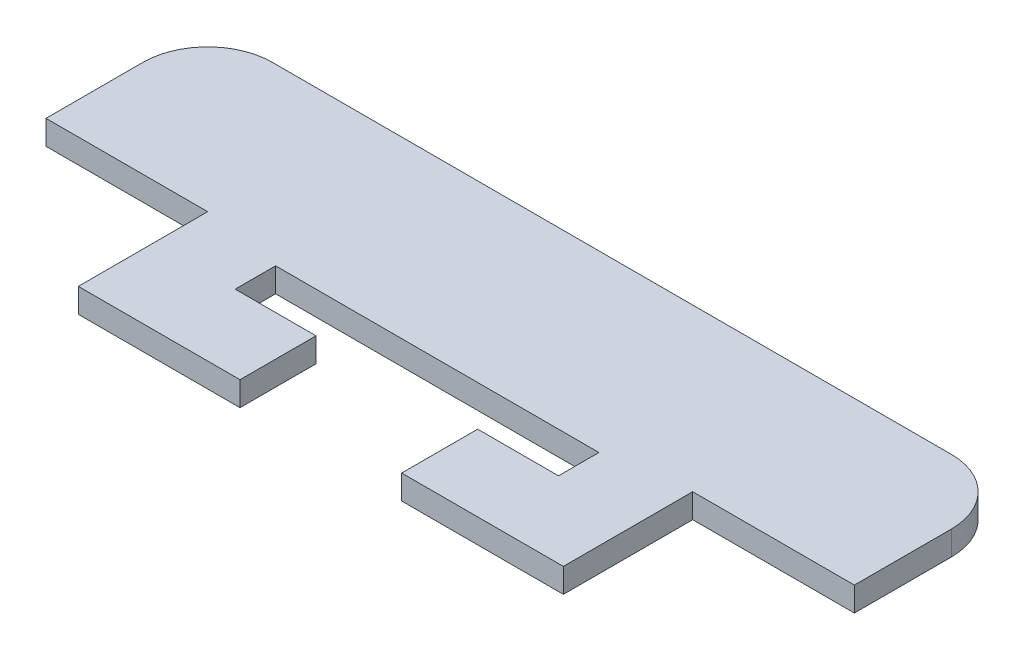
ISO-10303-21;
HEADER;
FILE_DESCRIPTION(('STEP AP214'),'2;1');
FILE_NAME('part.step','',(''),(''),'','','');
FILE_SCHEMA(('AUTOMOTIVE_DESIGN { 1 0 10303 214 1 1 1 1 }'));
ENDSEC;
DATA;
#1=APPLICATION_CONTEXT('core data for automotive mechanical design processes');
#2=APPLICATION_PROTOCOL_DEFINITION('international standard','automotive_design',2000,#1);
#3=PRODUCT_CONTEXT('',#1,'mechanical');
#4=PRODUCT('Part','Part','',(#3));
#5=PRODUCT_RELATED_PRODUCT_CATEGORY('part','',(#4));
#6=PRODUCT_DEFINITION_FORMATION('','',#4);
#7=PRODUCT_DEFINITION_CONTEXT('part definition',#1,'design');
#8=PRODUCT_DEFINITION('design','',#6,#7);
#9=PRODUCT_DEFINITION_SHAPE('','',#8);
#10=(LENGTH_UNIT() NAMED_UNIT(*) SI_UNIT(.MILLI.,.METRE.));
#11=(NAMED_UNIT(*) PLANE_ANGLE_UNIT() SI_UNIT($,.RADIAN.));
#12=(NAMED_UNIT(*) SI_UNIT($,.STERADIAN.) SOLID_ANGLE_UNIT());
#13=UNCERTAINTY_MEASURE_WITH_UNIT(LENGTH_MEASURE(1.E-05),#10,'distance_accuracy_value','');
#14=(GEOMETRIC_REPRESENTATION_CONTEXT(3) GLOBAL_UNCERTAINTY_ASSIGNED_CONTEXT((#13)) GLOBAL_UNIT_ASSIGNED_CONTEXT((#10,
#11,#12)) REPRESENTATION_CONTEXT('',''));
#15=CARTESIAN_POINT('',(0.,0.,0.));
#16=DIRECTION('',(0.,0.,1.));
#17=DIRECTION('',(1.,0.,0.));
#18=AXIS2_PLACEMENT_3D('',#15,#16,#17);
#19=CARTESIAN_POINT('',(-31.75,1.905,0.));
#20=DIRECTION('',(1.,0.,0.));
#21=DIRECTION('',(0.,0.,-1.));
#22=AXIS2_PLACEMENT_3D('',#19,#20,#21);
#23=PLANE('',#22);
#24=DIRECTION('',(0.,0.,1.));
#25=VECTOR('',#24,1.);
#26=CARTESIAN_POINT('',(-31.75,1.905,0.));
#27=LINE('',#26,#25);
#28=CARTESIAN_POINT('',(-31.75,1.905,-7.62));
#29=VERTEX_POINT('',#28);
#30=CARTESIAN_POINT('',(-31.75,1.905,0.));
#31=VERTEX_POINT('',#30);
#32=EDGE_CURVE('E233',#29,#31,#27,.T.);
#33=ORIENTED_EDGE('',*,*,#32,.F.);
#34=DIRECTION('',(0.,-1.,0.));
#35=VECTOR('',#34,1.);
#36=CARTESIAN_POINT('',(-31.75,1.905,-7.62));
#37=LINE('',#36,#35);
#38=CARTESIAN_POINT('',(-31.75,0.,-7.62));
#39=VERTEX_POINT('',#38);
#40=EDGE_CURVE('E11',#29,#39,#37,.T.);
#41=ORIENTED_EDGE('',*,*,#40,.T.);
#42=DIRECTION('',(0.,0.,1.));
#43=VECTOR('',#42,1.);
#44=CARTESIAN_POINT('',(-31.75,0.,0.));
#45=LINE('',#44,#43);
#46=CARTESIAN_POINT('',(-31.75,0.,0.));
#47=VERTEX_POINT('',#46);
#48=EDGE_CURVE('E232',#39,#47,#45,.T.);
#49=ORIENTED_EDGE('',*,*,#48,.T.);
#50=DIRECTION('',(0.,-1.,0.));
#51=VECTOR('',#50,1.);
#52=CARTESIAN_POINT('',(-31.75,1.905,0.));
#53=LINE('',#52,#51);
#54=EDGE_CURVE('E331',#31,#47,#53,.T.);
#55=ORIENTED_EDGE('',*,*,#54,.F.);
#56=EDGE_LOOP('',(#33,#41,#49,#55));
#57=FACE_BOUND('',#56,.T.);
#58=ADVANCED_FACE('F41',(#57),#23,.F.);
#59=CARTESIAN_POINT('',(-31.75,1.905,0.));
#60=DIRECTION('',(0.,0.,-1.));
#61=DIRECTION('',(-1.,0.,0.));
#62=AXIS2_PLACEMENT_3D('',#59,#60,#61);
#63=PLANE('',#62);
#64=DIRECTION('',(1.,0.,0.));
#65=VECTOR('',#64,1.);
#66=CARTESIAN_POINT('',(-31.75,0.,0.));
#67=LINE('',#66,#65);
#68=CARTESIAN_POINT('',(-19.05,0.,0.));
#69=VERTEX_POINT('',#68);
#70=EDGE_CURVE('E275',#47,#69,#67,.T.);
#71=ORIENTED_EDGE('',*,*,#70,.T.);
#72=DIRECTION('',(0.,-1.,0.));
#73=VECTOR('',#72,1.);
#74=CARTESIAN_POINT('',(-19.05,1.905,0.));
#75=LINE('',#74,#73);
#76=CARTESIAN_POINT('',(-19.05,1.905,0.));
#77=VERTEX_POINT('',#76);
#78=EDGE_CURVE('E327',#77,#69,#75,.T.);
#79=ORIENTED_EDGE('',*,*,#78,.F.);
#80=DIRECTION('',(1.,0.,0.));
#81=VECTOR('',#80,1.);
#82=CARTESIAN_POINT('',(-31.75,1.905,0.));
#83=LINE('',#82,#81);
#84=EDGE_CURVE('E236',#31,#77,#83,.T.);
#85=ORIENTED_EDGE('',*,*,#84,.F.);
#86=ORIENTED_EDGE('',*,*,#54,.T.);
#87=EDGE_LOOP('',(#71,#79,#85,#86));
#88=FACE_BOUND('',#87,.T.);
#89=ADVANCED_FACE('F415',(#88),#63,.F.);
#90=CARTESIAN_POINT('',(-19.05,1.905,0.));
#91=DIRECTION('',(1.,0.,0.));
#92=DIRECTION('',(0.,0.,-1.));
#93=AXIS2_PLACEMENT_3D('',#90,#91,#92);
#94=PLANE('',#93);
#95=DIRECTION('',(0.,0.,1.));
#96=VECTOR('',#95,1.);
#97=CARTESIAN_POINT('',(-19.05,0.,0.));
#98=LINE('',#97,#96);
#99=CARTESIAN_POINT('',(-19.05,0.,10.16));
#100=VERTEX_POINT('',#99);
#101=EDGE_CURVE('E278',#69,#100,#98,.T.);
#102=ORIENTED_EDGE('',*,*,#101,.T.);
#103=DIRECTION('',(0.,-1.,0.));
#104=VECTOR('',#103,1.);
#105=CARTESIAN_POINT('',(-19.05,1.905,10.16));
#106=LINE('',#105,#104);
#107=CARTESIAN_POINT('',(-19.05,1.905,10.16));
#108=VERTEX_POINT('',#107);
#109=EDGE_CURVE('E323',#108,#100,#106,.T.);
#110=ORIENTED_EDGE('',*,*,#109,.F.);
#111=DIRECTION('',(0.,0.,1.));
#112=VECTOR('',#111,1.);
#113=CARTESIAN_POINT('',(-19.05,1.905,0.));
#114=LINE('',#113,#112);
#115=EDGE_CURVE('E240',#77,#108,#114,.T.);
#116=ORIENTED_EDGE('',*,*,#115,.F.);
#117=ORIENTED_EDGE('',*,*,#78,.T.);
#118=EDGE_LOOP('',(#102,#110,#116,#117));
#119=FACE_BOUND('',#118,.T.);
#120=ADVANCED_FACE('F411',(#119),#94,.F.);
#121=CARTESIAN_POINT('',(-19.05,1.905,10.16));
#122=DIRECTION('',(0.,0.,-1.));
#123=DIRECTION('',(-1.,0.,0.));
#124=AXIS2_PLACEMENT_3D('',#121,#122,#123);
#125=PLANE('',#124);
#126=DIRECTION('',(1.,0.,0.));
#127=VECTOR('',#126,1.);
#128=CARTESIAN_POINT('',(-19.05,0.,10.16));
#129=LINE('',#128,#127);
#130=CARTESIAN_POINT('',(-6.35,0.,10.16));
#131=VERTEX_POINT('',#130);
#132=EDGE_CURVE('E281',#100,#131,#129,.T.);
#133=ORIENTED_EDGE('',*,*,#132,.T.);
#134=DIRECTION('',(0.,1.,0.));
#135=VECTOR('',#134,1.);
#136=CARTESIAN_POINT('',(-6.35,-14.0327816558229,10.16));
#137=LINE('',#136,#135);
#138=CARTESIAN_POINT('',(-6.35,1.905,10.16));
#139=VERTEX_POINT('',#138);
#140=EDGE_CURVE('E213',#131,#139,#137,.T.);
#141=ORIENTED_EDGE('',*,*,#140,.T.);
#142=DIRECTION('',(1.,0.,0.));
#143=VECTOR('',#142,1.);
#144=CARTESIAN_POINT('',(-19.05,1.905,10.16));
#145=LINE('',#144,#143);
#146=EDGE_CURVE('E243',#108,#139,#145,.T.);
#147=ORIENTED_EDGE('',*,*,#146,.F.);
#148=ORIENTED_EDGE('',*,*,#109,.T.);
#149=EDGE_LOOP('',(#133,#141,#147,#148));
#150=FACE_BOUND('',#149,.T.);
#151=ADVANCED_FACE('F407',(#150),#125,.F.);
#152=CARTESIAN_POINT('',(-12.7,1.905,10.16));
#153=DIRECTION('',(-1.,0.,0.));
#154=DIRECTION('',(0.,0.,1.));
#155=AXIS2_PLACEMENT_3D('',#152,#153,#154);
#156=PLANE('',#155);
#157=DIRECTION('',(0.,0.,-1.));
#158=VECTOR('',#157,1.);
#159=CARTESIAN_POINT('',(-12.7,1.905,10.16));
#160=LINE('',#159,#158);
#161=CARTESIAN_POINT('',(-12.7,1.905,4.191));
#162=VERTEX_POINT('',#161);
#163=CARTESIAN_POINT('',(-12.7,1.905,1.016));
#164=VERTEX_POINT('',#163);
#165=EDGE_CURVE('E246',#162,#164,#160,.T.);
#166=ORIENTED_EDGE('',*,*,#165,.F.);
#167=DIRECTION('',(0.,-1.,0.));
#168=VECTOR('',#167,1.);
#169=CARTESIAN_POINT('',(-12.7,1.905,4.191));
#170=LINE('',#169,#168);
#171=CARTESIAN_POINT('',(-12.7,0.,4.191));
#172=VERTEX_POINT('',#171);
#173=EDGE_CURVE('E219',#162,#172,#170,.T.);
#174=ORIENTED_EDGE('',*,*,#173,.T.);
#175=DIRECTION('',(0.,0.,-1.));
#176=VECTOR('',#175,1.);
#177=CARTESIAN_POINT('',(-12.7,0.,10.16));
#178=LINE('',#177,#176);
#179=CARTESIAN_POINT('',(-12.7,0.,1.016));
#180=VERTEX_POINT('',#179);
#181=EDGE_CURVE('E284',#172,#180,#178,.T.);
#182=ORIENTED_EDGE('',*,*,#181,.T.);
#183=DIRECTION('',(0.,-1.,0.));
#184=VECTOR('',#183,1.);
#185=CARTESIAN_POINT('',(-12.7,1.905,1.016));
#186=LINE('',#185,#184);
#187=EDGE_CURVE('E319',#164,#180,#186,.T.);
#188=ORIENTED_EDGE('',*,*,#187,.F.);
#189=EDGE_LOOP('',(#166,#174,#182,#188));
#190=FACE_BOUND('',#189,.T.);
#191=ADVANCED_FACE('F395',(#190),#156,.F.);
#192=CARTESIAN_POINT('',(-12.7,1.905,1.016));
#193=DIRECTION('',(0.,0.,-1.));
#194=DIRECTION('',(-1.,0.,0.));
#195=AXIS2_PLACEMENT_3D('',#192,#193,#194);
#196=PLANE('',#195);
#197=DIRECTION('',(1.,0.,0.));
#198=VECTOR('',#197,1.);
#199=CARTESIAN_POINT('',(-12.7,0.,1.016));
#200=LINE('',#199,#198);
#201=CARTESIAN_POINT('',(12.7,0.,1.016));
#202=VERTEX_POINT('',#201);
#203=EDGE_CURVE('E287',#180,#202,#200,.T.);
#204=ORIENTED_EDGE('',*,*,#203,.T.);
#205=DIRECTION('',(0.,-1.,0.));
#206=VECTOR('',#205,1.);
#207=CARTESIAN_POINT('',(12.7,1.905,1.016));
#208=LINE('',#207,#206);
#209=CARTESIAN_POINT('',(12.7,1.905,1.016));
#210=VERTEX_POINT('',#209);
#211=EDGE_CURVE('E315',#210,#202,#208,.T.);
#212=ORIENTED_EDGE('',*,*,#211,.F.);
#213=DIRECTION('',(1.,0.,0.));
#214=VECTOR('',#213,1.);
#215=CARTESIAN_POINT('',(-12.7,1.905,1.016));
#216=LINE('',#215,#214);
#217=EDGE_CURVE('E249',#164,#210,#216,.T.);
#218=ORIENTED_EDGE('',*,*,#217,.F.);
#219=ORIENTED_EDGE('',*,*,#187,.T.);
#220=EDGE_LOOP('',(#204,#212,#218,#219));
#221=FACE_BOUND('',#220,.T.);
#222=ADVANCED_FACE('F389',(#221),#196,.F.);
#223=CARTESIAN_POINT('',(12.7,1.905,10.16));
#224=DIRECTION('',(1.,0.,0.));
#225=DIRECTION('',(0.,0.,-1.));
#226=AXIS2_PLACEMENT_3D('',#223,#224,#225);
#227=PLANE('',#226);
#228=DIRECTION('',(0.,0.,1.));
#229=VECTOR('',#228,1.);
#230=CARTESIAN_POINT('',(12.7,0.,10.16));
#231=LINE('',#230,#229);
#232=CARTESIAN_POINT('',(12.7,0.,4.191));
#233=VERTEX_POINT('',#232);
#234=EDGE_CURVE('E180',#202,#233,#231,.T.);
#235=ORIENTED_EDGE('',*,*,#234,.T.);
#236=DIRECTION('',(0.,1.,0.));
#237=VECTOR('',#236,1.);
#238=CARTESIAN_POINT('',(12.7,1.905,4.191));
#239=LINE('',#238,#237);
#240=CARTESIAN_POINT('',(12.7,1.905,4.191));
#241=VERTEX_POINT('',#240);
#242=EDGE_CURVE('E205',#233,#241,#239,.T.);
#243=ORIENTED_EDGE('',*,*,#242,.T.);
#244=DIRECTION('',(0.,0.,1.));
#245=VECTOR('',#244,1.);
#246=CARTESIAN_POINT('',(12.7,1.905,10.16));
#247=LINE('',#246,#245);
#248=EDGE_CURVE('E252',#210,#241,#247,.T.);
#249=ORIENTED_EDGE('',*,*,#248,.F.);
#250=ORIENTED_EDGE('',*,*,#211,.T.);
#251=EDGE_LOOP('',(#235,#243,#249,#250));
#252=FACE_BOUND('',#251,.T.);
#253=ADVANCED_FACE('F385',(#252),#227,.F.);
#254=CARTESIAN_POINT('',(12.7,1.905,10.16));
#255=DIRECTION('',(0.,0.,-1.));
#256=DIRECTION('',(-1.,0.,0.));
#257=AXIS2_PLACEMENT_3D('',#254,#255,#256);
#258=PLANE('',#257);
#259=DIRECTION('',(1.,0.,0.));
#260=VECTOR('',#259,1.);
#261=CARTESIAN_POINT('',(12.7,0.,10.16));
#262=LINE('',#261,#260);
#263=CARTESIAN_POINT('',(6.35000000000001,0.,10.16));
#264=VERTEX_POINT('',#263);
#265=CARTESIAN_POINT('',(19.05,0.,10.16));
#266=VERTEX_POINT('',#265);
#267=EDGE_CURVE('E167',#264,#266,#262,.T.);
#268=ORIENTED_EDGE('',*,*,#267,.T.);
#269=DIRECTION('',(0.,-1.,0.));
#270=VECTOR('',#269,1.);
#271=CARTESIAN_POINT('',(19.05,1.905,10.16));
#272=LINE('',#271,#270);
#273=CARTESIAN_POINT('',(19.05,1.905,10.16));
#274=VERTEX_POINT('',#273);
#275=EDGE_CURVE('E312',#274,#266,#272,.T.);
#276=ORIENTED_EDGE('',*,*,#275,.F.);
#277=DIRECTION('',(1.,0.,0.));
#278=VECTOR('',#277,1.);
#279=CARTESIAN_POINT('',(12.7,1.905,10.16));
#280=LINE('',#279,#278);
#281=CARTESIAN_POINT('',(6.35000000000001,1.905,10.16));
#282=VERTEX_POINT('',#281);
#283=EDGE_CURVE('E185',#282,#274,#280,.T.);
#284=ORIENTED_EDGE('',*,*,#283,.F.);
#285=DIRECTION('',(0.,1.,0.));
#286=VECTOR('',#285,1.);
#287=CARTESIAN_POINT('',(6.35000000000001,-14.0327816558229,10.16));
#288=LINE('',#287,#286);
#289=EDGE_CURVE('E183',#264,#282,#288,.T.);
#290=ORIENTED_EDGE('',*,*,#289,.F.);
#291=EDGE_LOOP('',(#268,#276,#284,#290));
#292=FACE_BOUND('',#291,.T.);
#293=ADVANCED_FACE('F184',(#292),#258,.F.);
#294=CARTESIAN_POINT('',(19.05,1.905,0.));
#295=DIRECTION('',(-1.,0.,0.));
#296=DIRECTION('',(0.,0.,1.));
#297=AXIS2_PLACEMENT_3D('',#294,#295,#296);
#298=PLANE('',#297);
#299=DIRECTION('',(0.,-1.,0.));
#300=VECTOR('',#299,1.);
#301=CARTESIAN_POINT('',(19.05,1.905,0.));
#302=LINE('',#301,#300);
#303=CARTESIAN_POINT('',(19.05,1.905,0.));
#304=VERTEX_POINT('',#303);
#305=CARTESIAN_POINT('',(19.05,0.,0.));
#306=VERTEX_POINT('',#305);
#307=EDGE_CURVE('E308',#304,#306,#302,.T.);
#308=ORIENTED_EDGE('',*,*,#307,.F.);
#309=DIRECTION('',(0.,0.,-1.));
#310=VECTOR('',#309,1.);
#311=CARTESIAN_POINT('',(19.05,1.905,0.));
#312=LINE('',#311,#310);
#313=EDGE_CURVE('E258',#274,#304,#312,.T.);
#314=ORIENTED_EDGE('',*,*,#313,.F.);
#315=ORIENTED_EDGE('',*,*,#275,.T.);
#316=DIRECTION('',(0.,0.,-1.));
#317=VECTOR('',#316,1.);
#318=CARTESIAN_POINT('',(19.05,0.,0.));
#319=LINE('',#318,#317);
#320=EDGE_CURVE('E175',#266,#306,#319,.T.);
#321=ORIENTED_EDGE('',*,*,#320,.T.);
#322=EDGE_LOOP('',(#308,#314,#315,#321));
#323=FACE_BOUND('',#322,.T.);
#324=ADVANCED_FACE('F378',(#323),#298,.F.);
#325=CARTESIAN_POINT('',(19.05,1.905,0.));
#326=DIRECTION('',(0.,0.,-1.));
#327=DIRECTION('',(-1.,0.,0.));
#328=AXIS2_PLACEMENT_3D('',#325,#326,#327);
#329=PLANE('',#328);
#330=DIRECTION('',(1.,0.,0.));
#331=VECTOR('',#330,1.);
#332=CARTESIAN_POINT('',(19.05,0.,0.));
#333=LINE('',#332,#331);
#334=CARTESIAN_POINT('',(31.75,0.,0.));
#335=VERTEX_POINT('',#334);
#336=EDGE_CURVE('E295',#306,#335,#333,.T.);
#337=ORIENTED_EDGE('',*,*,#336,.T.);
#338=DIRECTION('',(0.,-1.,0.));
#339=VECTOR('',#338,1.);
#340=CARTESIAN_POINT('',(31.75,1.905,0.));
#341=LINE('',#340,#339);
#342=CARTESIAN_POINT('',(31.75,1.905,0.));
#343=VERTEX_POINT('',#342);
#344=EDGE_CURVE('E272',#343,#335,#341,.T.);
#345=ORIENTED_EDGE('',*,*,#344,.F.);
#346=DIRECTION('',(1.,0.,0.));
#347=VECTOR('',#346,1.);
#348=CARTESIAN_POINT('',(19.05,1.905,0.));
#349=LINE('',#348,#347);
#350=EDGE_CURVE('E261',#304,#343,#349,.T.);
#351=ORIENTED_EDGE('',*,*,#350,.F.);
#352=ORIENTED_EDGE('',*,*,#307,.T.);
#353=EDGE_LOOP('',(#337,#345,#351,#352));
#354=FACE_BOUND('',#353,.T.);
#355=ADVANCED_FACE('F374',(#354),#329,.F.);
#356=CARTESIAN_POINT('',(31.75,1.905,0.));
#357=DIRECTION('',(-1.,0.,0.));
#358=DIRECTION('',(0.,0.,1.));
#359=AXIS2_PLACEMENT_3D('',#356,#357,#358);
#360=PLANE('',#359);
#361=DIRECTION('',(0.,0.,-1.));
#362=VECTOR('',#361,1.);
#363=CARTESIAN_POINT('',(31.75,0.,0.));
#364=LINE('',#363,#362);
#365=CARTESIAN_POINT('',(31.75,0.,-7.62));
#366=VERTEX_POINT('',#365);
#367=EDGE_CURVE('E298',#335,#366,#364,.T.);
#368=ORIENTED_EDGE('',*,*,#367,.T.);
#369=DIRECTION('',(0.,-1.,0.));
#370=VECTOR('',#369,1.);
#371=CARTESIAN_POINT('',(31.75,1.905,-7.62));
#372=LINE('',#371,#370);
#373=CARTESIAN_POINT('',(31.75,1.905,-7.62));
#374=VERTEX_POINT('',#373);
#375=EDGE_CURVE('E348',#366,#374,#372,.F.);
#376=ORIENTED_EDGE('',*,*,#375,.T.);
#377=DIRECTION('',(0.,0.,-1.));
#378=VECTOR('',#377,1.);
#379=CARTESIAN_POINT('',(31.75,1.905,0.));
#380=LINE('',#379,#378);
#381=EDGE_CURVE('E264',#343,#374,#380,.T.);
#382=ORIENTED_EDGE('',*,*,#381,.F.);
#383=ORIENTED_EDGE('',*,*,#344,.T.);
#384=EDGE_LOOP('',(#368,#376,#382,#383));
#385=FACE_BOUND('',#384,.T.);
#386=ADVANCED_FACE('F370',(#385),#360,.F.);
#387=CARTESIAN_POINT('',(-31.75,1.905,-12.7));
#388=DIRECTION('',(0.,0.,1.));
#389=DIRECTION('',(1.,0.,0.));
#390=AXIS2_PLACEMENT_3D('',#387,#388,#389);
#391=PLANE('',#390);
#392=DIRECTION('',(-1.,0.,0.));
#393=VECTOR('',#392,1.);
#394=CARTESIAN_POINT('',(-31.75,1.905,-12.7));
#395=LINE('',#394,#393);
#396=CARTESIAN_POINT('',(26.67,1.905,-12.7));
#397=VERTEX_POINT('',#396);
#398=CARTESIAN_POINT('',(-26.67,1.905,-12.7));
#399=VERTEX_POINT('',#398);
#400=EDGE_CURVE('E268',#397,#399,#395,.T.);
#401=ORIENTED_EDGE('',*,*,#400,.F.);
#402=DIRECTION('',(0.,-1.,0.));
#403=VECTOR('',#402,1.);
#404=CARTESIAN_POINT('',(26.67,1.905,-12.7));
#405=LINE('',#404,#403);
#406=CARTESIAN_POINT('',(26.67,0.,-12.7));
#407=VERTEX_POINT('',#406);
#408=EDGE_CURVE('E338',#397,#407,#405,.T.);
#409=ORIENTED_EDGE('',*,*,#408,.T.);
#410=DIRECTION('',(-1.,0.,0.));
#411=VECTOR('',#410,1.);
#412=CARTESIAN_POINT('',(-31.75,0.,-12.7));
#413=LINE('',#412,#411);
#414=CARTESIAN_POINT('',(-26.67,0.,-12.7));
#415=VERTEX_POINT('',#414);
#416=EDGE_CURVE('E237',#407,#415,#413,.T.);
#417=ORIENTED_EDGE('',*,*,#416,.T.);
#418=DIRECTION('',(0.,-1.,0.));
#419=VECTOR('',#418,1.);
#420=CARTESIAN_POINT('',(-26.67,1.905,-12.7));
#421=LINE('',#420,#419);
#422=EDGE_CURVE('E335',#415,#399,#421,.F.);
#423=ORIENTED_EDGE('',*,*,#422,.T.);
#424=EDGE_LOOP('',(#401,#409,#417,#423));
#425=FACE_BOUND('',#424,.T.);
#426=ADVANCED_FACE('F364',(#425),#391,.F.);
#427=CARTESIAN_POINT('',(0.,1.905,0.));
#428=DIRECTION('',(0.,-1.,0.));
#429=DIRECTION('',(0.,0.,-1.));
#430=AXIS2_PLACEMENT_3D('',#427,#428,#429);
#431=PLANE('',#430);
#432=ORIENTED_EDGE('',*,*,#248,.T.);
#433=DIRECTION('',(-1.,0.,0.));
#434=VECTOR('',#433,1.);
#435=CARTESIAN_POINT('',(19.05,1.905,4.191));
#436=LINE('',#435,#434);
#437=CARTESIAN_POINT('',(6.35000000000001,1.905,4.191));
#438=VERTEX_POINT('',#437);
#439=EDGE_CURVE('E57',#241,#438,#436,.T.);
#440=ORIENTED_EDGE('',*,*,#439,.T.);
#441=DIRECTION('',(0.,0.,1.));
#442=VECTOR('',#441,1.);
#443=CARTESIAN_POINT('',(6.35000000000001,1.905,4.191));
#444=LINE('',#443,#442);
#445=EDGE_CURVE('E195',#438,#282,#444,.T.);
#446=ORIENTED_EDGE('',*,*,#445,.T.);
#447=ORIENTED_EDGE('',*,*,#283,.T.);
#448=ORIENTED_EDGE('',*,*,#313,.T.);
#449=ORIENTED_EDGE('',*,*,#350,.T.);
#450=ORIENTED_EDGE('',*,*,#381,.T.);
#451=CARTESIAN_POINT('',(26.67,1.905,-7.62));
#452=DIRECTION('',(0.,-1.,0.));
#453=DIRECTION('',(0.,0.,-1.));
#454=AXIS2_PLACEMENT_3D('',#451,#452,#453);
#455=CIRCLE('',#454,5.08);
#456=EDGE_CURVE('E50',#374,#397,#455,.F.);
#457=ORIENTED_EDGE('',*,*,#456,.T.);
#458=ORIENTED_EDGE('',*,*,#400,.T.);
#459=CARTESIAN_POINT('',(-26.67,1.905,-7.62));
#460=DIRECTION('',(0.,-1.,0.));
#461=DIRECTION('',(0.,0.,-1.));
#462=AXIS2_PLACEMENT_3D('',#459,#460,#461);
#463=CIRCLE('',#462,5.08);
#464=EDGE_CURVE('E351',#399,#29,#463,.F.);
#465=ORIENTED_EDGE('',*,*,#464,.T.);
#466=ORIENTED_EDGE('',*,*,#32,.T.);
#467=ORIENTED_EDGE('',*,*,#84,.T.);
#468=ORIENTED_EDGE('',*,*,#115,.T.);
#469=ORIENTED_EDGE('',*,*,#146,.T.);
#470=DIRECTION('',(0.,0.,-1.));
#471=VECTOR('',#470,1.);
#472=CARTESIAN_POINT('',(-6.35,1.905,4.191));
#473=LINE('',#472,#471);
#474=CARTESIAN_POINT('',(-6.35,1.905,4.191));
#475=VERTEX_POINT('',#474);
#476=EDGE_CURVE('E208',#139,#475,#473,.T.);
#477=ORIENTED_EDGE('',*,*,#476,.T.);
#478=DIRECTION('',(-1.,0.,0.));
#479=VECTOR('',#478,1.);
#480=CARTESIAN_POINT('',(-19.05,1.905,4.191));
#481=LINE('',#480,#479);
#482=EDGE_CURVE('E209',#475,#162,#481,.T.);
#483=ORIENTED_EDGE('',*,*,#482,.T.);
#484=ORIENTED_EDGE('',*,*,#165,.T.);
#485=ORIENTED_EDGE('',*,*,#217,.T.);
#486=EDGE_LOOP('',(#432,#440,#446,#447,#448,#449,#450,#457,#458,#465,#466,#467,#468,#469,#477,
#483,#484,#485));
#487=FACE_BOUND('',#486,.T.);
#488=ADVANCED_FACE('F357',(#487),#431,.F.);
#489=CARTESIAN_POINT('',(0.,0.,0.));
#490=DIRECTION('',(0.,-1.,0.));
#491=DIRECTION('',(0.,0.,-1.));
#492=AXIS2_PLACEMENT_3D('',#489,#490,#491);
#493=PLANE('',#492);
#494=ORIENTED_EDGE('',*,*,#336,.F.);
#495=ORIENTED_EDGE('',*,*,#320,.F.);
#496=ORIENTED_EDGE('',*,*,#267,.F.);
#497=DIRECTION('',(0.,0.,1.));
#498=VECTOR('',#497,1.);
#499=CARTESIAN_POINT('',(6.35000000000001,0.,4.191));
#500=LINE('',#499,#498);
#501=CARTESIAN_POINT('',(6.35000000000001,0.,4.191));
#502=VERTEX_POINT('',#501);
#503=EDGE_CURVE('E173',#502,#264,#500,.T.);
#504=ORIENTED_EDGE('',*,*,#503,.F.);
#505=DIRECTION('',(-1.,0.,0.));
#506=VECTOR('',#505,1.);
#507=CARTESIAN_POINT('',(19.05,0.,4.191));
#508=LINE('',#507,#506);
#509=EDGE_CURVE('E190',#233,#502,#508,.T.);
#510=ORIENTED_EDGE('',*,*,#509,.F.);
#511=ORIENTED_EDGE('',*,*,#234,.F.);
#512=ORIENTED_EDGE('',*,*,#203,.F.);
#513=ORIENTED_EDGE('',*,*,#181,.F.);
#514=DIRECTION('',(-1.,0.,0.));
#515=VECTOR('',#514,1.);
#516=CARTESIAN_POINT('',(-19.05,0.,4.191));
#517=LINE('',#516,#515);
#518=CARTESIAN_POINT('',(-6.35,0.,4.191));
#519=VERTEX_POINT('',#518);
#520=EDGE_CURVE('E65',#519,#172,#517,.T.);
#521=ORIENTED_EDGE('',*,*,#520,.F.);
#522=DIRECTION('',(0.,0.,-1.));
#523=VECTOR('',#522,1.);
#524=CARTESIAN_POINT('',(-6.35,0.,4.191));
#525=LINE('',#524,#523);
#526=EDGE_CURVE('E221',#131,#519,#525,.T.);
#527=ORIENTED_EDGE('',*,*,#526,.F.);
#528=ORIENTED_EDGE('',*,*,#132,.F.);
#529=ORIENTED_EDGE('',*,*,#101,.F.);
#530=ORIENTED_EDGE('',*,*,#70,.F.);
#531=ORIENTED_EDGE('',*,*,#48,.F.);
#532=CARTESIAN_POINT('',(-26.67,0.,-7.62));
#533=DIRECTION('',(0.,-1.,0.));
#534=DIRECTION('',(0.,0.,-1.));
#535=AXIS2_PLACEMENT_3D('',#532,#533,#534);
#536=CIRCLE('',#535,5.08);
#537=EDGE_CURVE('E342',#39,#415,#536,.T.);
#538=ORIENTED_EDGE('',*,*,#537,.T.);
#539=ORIENTED_EDGE('',*,*,#416,.F.);
#540=CARTESIAN_POINT('',(26.67,0.,-7.62));
#541=DIRECTION('',(0.,-1.,0.));
#542=DIRECTION('',(0.,0.,-1.));
#543=AXIS2_PLACEMENT_3D('',#540,#541,#542);
#544=CIRCLE('',#543,5.08);
#545=EDGE_CURVE('E345',#407,#366,#544,.T.);
#546=ORIENTED_EDGE('',*,*,#545,.T.);
#547=ORIENTED_EDGE('',*,*,#367,.F.);
#548=EDGE_LOOP('',(#494,#495,#496,#504,#510,#511,#512,#513,#521,#527,#528,#529,#530,#531,#538,
#539,#546,#547));
#549=FACE_BOUND('',#548,.T.);
#550=ADVANCED_FACE('F170',(#549),#493,.T.);
#551=CARTESIAN_POINT('',(26.67,1.905,-7.62));
#552=DIRECTION('',(0.,-1.,0.));
#553=DIRECTION('',(0.,0.,-1.));
#554=AXIS2_PLACEMENT_3D('',#551,#552,#553);
#555=CYLINDRICAL_SURFACE('',#554,5.08);
#556=ORIENTED_EDGE('',*,*,#456,.F.);
#557=ORIENTED_EDGE('',*,*,#375,.F.);
#558=ORIENTED_EDGE('',*,*,#545,.F.);
#559=ORIENTED_EDGE('',*,*,#408,.F.);
#560=EDGE_LOOP('',(#556,#557,#558,#559));
#561=FACE_BOUND('',#560,.T.);
#562=ADVANCED_FACE('F367',(#561),#555,.T.);
#563=CARTESIAN_POINT('',(-26.67,1.905,-7.62));
#564=DIRECTION('',(0.,-1.,0.));
#565=DIRECTION('',(0.,0.,-1.));
#566=AXIS2_PLACEMENT_3D('',#563,#564,#565);
#567=CYLINDRICAL_SURFACE('',#566,5.08);
#568=ORIENTED_EDGE('',*,*,#464,.F.);
#569=ORIENTED_EDGE('',*,*,#422,.F.);
#570=ORIENTED_EDGE('',*,*,#537,.F.);
#571=ORIENTED_EDGE('',*,*,#40,.F.);
#572=EDGE_LOOP('',(#568,#569,#570,#571));
#573=FACE_BOUND('',#572,.T.);
#574=ADVANCED_FACE('F43',(#573),#567,.T.);
#575=CARTESIAN_POINT('',(-19.05,-14.0327816558229,4.191));
#576=DIRECTION('',(0.,0.,-1.));
#577=DIRECTION('',(-1.,0.,0.));
#578=AXIS2_PLACEMENT_3D('',#575,#576,#577);
#579=PLANE('',#578);
#580=ORIENTED_EDGE('',*,*,#173,.F.);
#581=ORIENTED_EDGE('',*,*,#482,.F.);
#582=DIRECTION('',(0.,1.,0.));
#583=VECTOR('',#582,1.);
#584=CARTESIAN_POINT('',(-6.35,-14.0327816558229,4.191));
#585=LINE('',#584,#583);
#586=EDGE_CURVE('E220',#519,#475,#585,.T.);
#587=ORIENTED_EDGE('',*,*,#586,.F.);
#588=ORIENTED_EDGE('',*,*,#520,.T.);
#589=EDGE_LOOP('',(#580,#581,#587,#588));
#590=FACE_BOUND('',#589,.T.);
#591=ADVANCED_FACE('F397',(#590),#579,.T.);
#592=CARTESIAN_POINT('',(-6.35,-14.0327816558229,4.191));
#593=DIRECTION('',(1.,0.,0.));
#594=DIRECTION('',(0.,0.,-1.));
#595=AXIS2_PLACEMENT_3D('',#592,#593,#594);
#596=PLANE('',#595);
#597=ORIENTED_EDGE('',*,*,#140,.F.);
#598=ORIENTED_EDGE('',*,*,#526,.T.);
#599=ORIENTED_EDGE('',*,*,#586,.T.);
#600=ORIENTED_EDGE('',*,*,#476,.F.);
#601=EDGE_LOOP('',(#597,#598,#599,#600));
#602=FACE_BOUND('',#601,.T.);
#603=ADVANCED_FACE('F402',(#602),#596,.T.);
#604=CARTESIAN_POINT('',(19.05,-14.0327816558229,4.191));
#605=DIRECTION('',(0.,0.,-1.));
#606=DIRECTION('',(-1.,0.,0.));
#607=AXIS2_PLACEMENT_3D('',#604,#605,#606);
#608=PLANE('',#607);
#609=ORIENTED_EDGE('',*,*,#242,.F.);
#610=ORIENTED_EDGE('',*,*,#509,.T.);
#611=DIRECTION('',(0.,1.,0.));
#612=VECTOR('',#611,1.);
#613=CARTESIAN_POINT('',(6.35000000000001,-14.0327816558229,4.191));
#614=LINE('',#613,#612);
#615=EDGE_CURVE('E193',#502,#438,#614,.T.);
#616=ORIENTED_EDGE('',*,*,#615,.T.);
#617=ORIENTED_EDGE('',*,*,#439,.F.);
#618=EDGE_LOOP('',(#609,#610,#616,#617));
#619=FACE_BOUND('',#618,.T.);
#620=ADVANCED_FACE('F381',(#619),#608,.T.);
#621=CARTESIAN_POINT('',(6.35000000000001,-14.0327816558229,4.191));
#622=DIRECTION('',(-1.,0.,0.));
#623=DIRECTION('',(0.,0.,1.));
#624=AXIS2_PLACEMENT_3D('',#621,#622,#623);
#625=PLANE('',#624);
#626=ORIENTED_EDGE('',*,*,#615,.F.);
#627=ORIENTED_EDGE('',*,*,#503,.T.);
#628=ORIENTED_EDGE('',*,*,#289,.T.);
#629=ORIENTED_EDGE('',*,*,#445,.F.);
#630=EDGE_LOOP('',(#626,#627,#628,#629));
#631=FACE_BOUND('',#630,.T.);
#632=ADVANCED_FACE('F192',(#631),#625,.T.);
#633=CLOSED_SHELL('',(#58,#89,#120,#151,#191,#222,#253,#293,#324,#355,#386,#426,#488,#550,#562,
#574,#591,#603,#620,#632));
#634=MANIFOLD_SOLID_BREP('B2',#633);
#635=ADVANCED_BREP_SHAPE_REPRESENTATION('',(#18,#634),#14);
#636=SHAPE_DEFINITION_REPRESENTATION(#9,#635);
ENDSEC;
END-ISO-10303-21;
